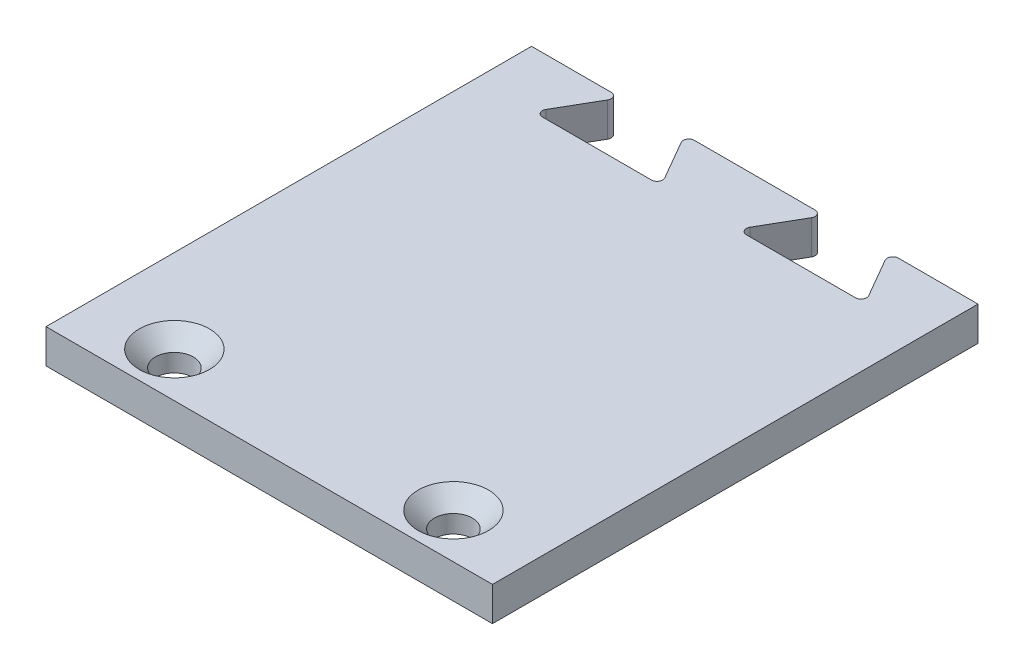
ISO-10303-21;
HEADER;
FILE_DESCRIPTION(('STEP AP214'),'2;1');
FILE_NAME('part.step','',(''),(''),'','','');
FILE_SCHEMA(('AUTOMOTIVE_DESIGN { 1 0 10303 214 1 1 1 1 }'));
ENDSEC;
DATA;
#1=APPLICATION_CONTEXT('core data for automotive mechanical design processes');
#2=APPLICATION_PROTOCOL_DEFINITION('international standard','automotive_design',2000,#1);
#3=PRODUCT_CONTEXT('',#1,'mechanical');
#4=PRODUCT('Part','Part','',(#3));
#5=PRODUCT_RELATED_PRODUCT_CATEGORY('part','',(#4));
#6=PRODUCT_DEFINITION_FORMATION('','',#4);
#7=PRODUCT_DEFINITION_CONTEXT('part definition',#1,'design');
#8=PRODUCT_DEFINITION('design','',#6,#7);
#9=PRODUCT_DEFINITION_SHAPE('','',#8);
#10=(LENGTH_UNIT() NAMED_UNIT(*) SI_UNIT(.MILLI.,.METRE.));
#11=(NAMED_UNIT(*) PLANE_ANGLE_UNIT() SI_UNIT($,.RADIAN.));
#12=(NAMED_UNIT(*) SI_UNIT($,.STERADIAN.) SOLID_ANGLE_UNIT());
#13=UNCERTAINTY_MEASURE_WITH_UNIT(LENGTH_MEASURE(1.E-05),#10,'distance_accuracy_value','');
#14=(GEOMETRIC_REPRESENTATION_CONTEXT(3) GLOBAL_UNCERTAINTY_ASSIGNED_CONTEXT((#13)) GLOBAL_UNIT_ASSIGNED_CONTEXT((#10,
#11,#12)) REPRESENTATION_CONTEXT('',''));
#15=CARTESIAN_POINT('',(0.,0.,0.));
#16=DIRECTION('',(0.,0.,1.));
#17=DIRECTION('',(1.,0.,0.));
#18=AXIS2_PLACEMENT_3D('',#15,#16,#17);
#19=CARTESIAN_POINT('',(0.,3.05,0.));
#20=DIRECTION('',(0.,-1.,0.));
#21=DIRECTION('',(0.,0.,-1.));
#22=AXIS2_PLACEMENT_3D('',#19,#20,#21);
#23=PLANE('',#22);
#24=CARTESIAN_POINT('',(7.5,3.05,-4.));
#25=DIRECTION('',(0.,1.,0.));
#26=DIRECTION('',(0.,0.,1.));
#27=AXIS2_PLACEMENT_3D('',#24,#25,#26);
#28=CIRCLE('',#27,3.15);
#29=CARTESIAN_POINT('',(7.5,3.05,-0.850000000000004));
#30=VERTEX_POINT('',#29);
#31=EDGE_CURVE('E613',#30,#30,#28,.T.);
#32=ORIENTED_EDGE('',*,*,#31,.F.);
#33=EDGE_LOOP('',(#32));
#34=FACE_BOUND('',#33,.T.);
#35=DIRECTION('',(-1.,0.,0.));
#36=VECTOR('',#35,1.);
#37=CARTESIAN_POINT('',(32.,3.05,-43.5));
#38=LINE('',#37,#36);
#39=CARTESIAN_POINT('',(40.,3.05,-43.5));
#40=VERTEX_POINT('',#39);
#41=CARTESIAN_POINT('',(32.8660254037844,3.05,-43.5));
#42=VERTEX_POINT('',#41);
#43=EDGE_CURVE('E184',#40,#42,#38,.T.);
#44=ORIENTED_EDGE('',*,*,#43,.T.);
#45=CARTESIAN_POINT('',(32.8660254037844,3.05,-43.));
#46=DIRECTION('',(0.,-1.,0.));
#47=DIRECTION('',(0.,0.,-1.));
#48=AXIS2_PLACEMENT_3D('',#45,#46,#47);
#49=CIRCLE('',#48,0.5);
#50=CARTESIAN_POINT('',(32.4330127018922,3.05,-42.75));
#51=VERTEX_POINT('',#50);
#52=EDGE_CURVE('E229',#42,#51,#49,.F.);
#53=ORIENTED_EDGE('',*,*,#52,.T.);
#54=DIRECTION('',(0.500000000000005,0.,0.866025403784436));
#55=VECTOR('',#54,1.);
#56=CARTESIAN_POINT('',(34.8867513459482,3.05,-38.5));
#57=LINE('',#56,#55);
#58=CARTESIAN_POINT('',(34.4537386440559,3.05,-39.25));
#59=VERTEX_POINT('',#58);
#60=EDGE_CURVE('E338',#51,#59,#57,.T.);
#61=ORIENTED_EDGE('',*,*,#60,.T.);
#62=CARTESIAN_POINT('',(34.0207259421637,3.05,-39.));
#63=DIRECTION('',(0.,-1.,0.));
#64=DIRECTION('',(0.,0.,-1.));
#65=AXIS2_PLACEMENT_3D('',#62,#63,#64);
#66=CIRCLE('',#65,0.5);
#67=CARTESIAN_POINT('',(34.0207259421637,3.05,-38.5));
#68=VERTEX_POINT('',#67);
#69=EDGE_CURVE('E260',#59,#68,#66,.T.);
#70=ORIENTED_EDGE('',*,*,#69,.T.);
#71=DIRECTION('',(-1.,0.,0.));
#72=VECTOR('',#71,1.);
#73=CARTESIAN_POINT('',(23.3867513459482,3.05,-38.5));
#74=LINE('',#73,#72);
#75=CARTESIAN_POINT('',(24.2527767497326,3.05,-38.5));
#76=VERTEX_POINT('',#75);
#77=EDGE_CURVE('E341',#68,#76,#74,.T.);
#78=ORIENTED_EDGE('',*,*,#77,.T.);
#79=CARTESIAN_POINT('',(24.2527767497326,3.05,-39.));
#80=DIRECTION('',(0.,-1.,0.));
#81=DIRECTION('',(0.,0.,-1.));
#82=AXIS2_PLACEMENT_3D('',#79,#80,#81);
#83=CIRCLE('',#82,0.5);
#84=CARTESIAN_POINT('',(23.8197640478404,3.05,-39.25));
#85=VERTEX_POINT('',#84);
#86=EDGE_CURVE('E264',#76,#85,#83,.T.);
#87=ORIENTED_EDGE('',*,*,#86,.T.);
#88=DIRECTION('',(0.500000000000004,0.,-0.866025403784437));
#89=VECTOR('',#88,1.);
#90=CARTESIAN_POINT('',(26.2735026918963,3.05,-43.5));
#91=LINE('',#90,#89);
#92=CARTESIAN_POINT('',(25.8404899900041,3.05,-42.75));
#93=VERTEX_POINT('',#92);
#94=EDGE_CURVE('E346',#85,#93,#91,.T.);
#95=ORIENTED_EDGE('',*,*,#94,.T.);
#96=CARTESIAN_POINT('',(25.4074772881119,3.05,-43.));
#97=DIRECTION('',(0.,-1.,0.));
#98=DIRECTION('',(0.,0.,-1.));
#99=AXIS2_PLACEMENT_3D('',#96,#97,#98);
#100=CIRCLE('',#99,0.5);
#101=CARTESIAN_POINT('',(25.4074772881119,3.05,-43.5));
#102=VERTEX_POINT('',#101);
#103=EDGE_CURVE('E227',#93,#102,#100,.F.);
#104=ORIENTED_EDGE('',*,*,#103,.T.);
#105=DIRECTION('',(-1.,0.,0.));
#106=VECTOR('',#105,1.);
#107=CARTESIAN_POINT('',(13.7264973081037,3.05,-43.5));
#108=LINE('',#107,#106);
#109=CARTESIAN_POINT('',(14.5925227118881,3.05,-43.5));
#110=VERTEX_POINT('',#109);
#111=EDGE_CURVE('E349',#102,#110,#108,.T.);
#112=ORIENTED_EDGE('',*,*,#111,.T.);
#113=CARTESIAN_POINT('',(14.5925227118881,3.05,-43.));
#114=DIRECTION('',(0.,-1.,0.));
#115=DIRECTION('',(0.,0.,-1.));
#116=AXIS2_PLACEMENT_3D('',#113,#114,#115);
#117=CIRCLE('',#116,0.5);
#118=CARTESIAN_POINT('',(14.1595100099959,3.05,-42.75));
#119=VERTEX_POINT('',#118);
#120=EDGE_CURVE('E225',#110,#119,#117,.F.);
#121=ORIENTED_EDGE('',*,*,#120,.T.);
#122=DIRECTION('',(0.500000000000004,0.,0.866025403784437));
#123=VECTOR('',#122,1.);
#124=CARTESIAN_POINT('',(16.6132486540518,3.05,-38.5));
#125=LINE('',#124,#123);
#126=CARTESIAN_POINT('',(16.1802359521596,3.05,-39.25));
#127=VERTEX_POINT('',#126);
#128=EDGE_CURVE('E295',#119,#127,#125,.T.);
#129=ORIENTED_EDGE('',*,*,#128,.T.);
#130=CARTESIAN_POINT('',(15.7472232502674,3.05,-39.));
#131=DIRECTION('',(0.,-1.,0.));
#132=DIRECTION('',(0.,0.,-1.));
#133=AXIS2_PLACEMENT_3D('',#130,#131,#132);
#134=CIRCLE('',#133,0.5);
#135=CARTESIAN_POINT('',(15.7472232502674,3.05,-38.5));
#136=VERTEX_POINT('',#135);
#137=EDGE_CURVE('E268',#127,#136,#134,.T.);
#138=ORIENTED_EDGE('',*,*,#137,.T.);
#139=DIRECTION('',(-1.,0.,0.));
#140=VECTOR('',#139,1.);
#141=CARTESIAN_POINT('',(5.11324865405184,3.05,-38.5));
#142=LINE('',#141,#140);
#143=CARTESIAN_POINT('',(5.97927405783628,3.05,-38.5));
#144=VERTEX_POINT('',#143);
#145=EDGE_CURVE('E290',#136,#144,#142,.T.);
#146=ORIENTED_EDGE('',*,*,#145,.T.);
#147=CARTESIAN_POINT('',(5.97927405783628,3.05,-39.));
#148=DIRECTION('',(0.,-1.,0.));
#149=DIRECTION('',(0.,0.,-1.));
#150=AXIS2_PLACEMENT_3D('',#147,#148,#149);
#151=CIRCLE('',#150,0.5);
#152=CARTESIAN_POINT('',(5.54626135594407,3.05,-39.25));
#153=VERTEX_POINT('',#152);
#154=EDGE_CURVE('E11',#144,#153,#151,.T.);
#155=ORIENTED_EDGE('',*,*,#154,.T.);
#156=DIRECTION('',(0.500000000000004,0.,-0.866025403784436));
#157=VECTOR('',#156,1.);
#158=CARTESIAN_POINT('',(8.,3.05,-43.5));
#159=LINE('',#158,#157);
#160=CARTESIAN_POINT('',(7.56698729810778,3.05,-42.75));
#161=VERTEX_POINT('',#160);
#162=EDGE_CURVE('E289',#153,#161,#159,.T.);
#163=ORIENTED_EDGE('',*,*,#162,.T.);
#164=CARTESIAN_POINT('',(7.13397459621556,3.05,-43.));
#165=DIRECTION('',(0.,-1.,0.));
#166=DIRECTION('',(0.,0.,-1.));
#167=AXIS2_PLACEMENT_3D('',#164,#165,#166);
#168=CIRCLE('',#167,0.5);
#169=CARTESIAN_POINT('',(7.13397459621556,3.05,-43.5));
#170=VERTEX_POINT('',#169);
#171=EDGE_CURVE('E51',#161,#170,#168,.F.);
#172=ORIENTED_EDGE('',*,*,#171,.T.);
#173=DIRECTION('',(-1.,0.,0.));
#174=VECTOR('',#173,1.);
#175=CARTESIAN_POINT('',(0.,3.05,-43.5));
#176=LINE('',#175,#174);
#177=CARTESIAN_POINT('',(0.,3.05,-43.5));
#178=VERTEX_POINT('',#177);
#179=EDGE_CURVE('E292',#170,#178,#176,.T.);
#180=ORIENTED_EDGE('',*,*,#179,.T.);
#181=DIRECTION('',(0.,0.,1.));
#182=VECTOR('',#181,1.);
#183=CARTESIAN_POINT('',(0.,3.05,0.));
#184=LINE('',#183,#182);
#185=CARTESIAN_POINT('',(0.,3.05,0.));
#186=VERTEX_POINT('',#185);
#187=EDGE_CURVE('E190',#178,#186,#184,.T.);
#188=ORIENTED_EDGE('',*,*,#187,.T.);
#189=DIRECTION('',(1.,0.,0.));
#190=VECTOR('',#189,1.);
#191=CARTESIAN_POINT('',(40.,3.05,0.));
#192=LINE('',#191,#190);
#193=CARTESIAN_POINT('',(40.,3.05,0.));
#194=VERTEX_POINT('',#193);
#195=EDGE_CURVE('E185',#186,#194,#192,.T.);
#196=ORIENTED_EDGE('',*,*,#195,.T.);
#197=DIRECTION('',(0.,0.,-1.));
#198=VECTOR('',#197,1.);
#199=CARTESIAN_POINT('',(40.,3.05,-43.5));
#200=LINE('',#199,#198);
#201=EDGE_CURVE('E174',#194,#40,#200,.T.);
#202=ORIENTED_EDGE('',*,*,#201,.T.);
#203=EDGE_LOOP('',(#44,#53,#61,#70,#78,#87,#95,#104,#112,#121,#129,#138,#146,#155,#163,#172,
#180,#188,#196,#202));
#204=FACE_BOUND('',#203,.T.);
#205=CARTESIAN_POINT('',(32.5,3.05,-4.));
#206=DIRECTION('',(0.,1.,0.));
#207=DIRECTION('',(0.,0.,1.));
#208=AXIS2_PLACEMENT_3D('',#205,#206,#207);
#209=CIRCLE('',#208,3.15);
#210=CARTESIAN_POINT('',(32.5,3.05,-0.85));
#211=VERTEX_POINT('',#210);
#212=EDGE_CURVE('E620',#211,#211,#209,.T.);
#213=ORIENTED_EDGE('',*,*,#212,.F.);
#214=EDGE_LOOP('',(#213));
#215=FACE_BOUND('',#214,.T.);
#216=ADVANCED_FACE('F36',(#34,#204,#215),#23,.F.);
#217=CARTESIAN_POINT('',(40.,3.05,0.));
#218=DIRECTION('',(0.,0.,-1.));
#219=DIRECTION('',(-1.,0.,0.));
#220=AXIS2_PLACEMENT_3D('',#217,#218,#219);
#221=PLANE('',#220);
#222=DIRECTION('',(1.,0.,0.));
#223=VECTOR('',#222,1.);
#224=CARTESIAN_POINT('',(40.,0.,0.));
#225=LINE('',#224,#223);
#226=CARTESIAN_POINT('',(0.,0.,0.));
#227=VERTEX_POINT('',#226);
#228=CARTESIAN_POINT('',(40.,0.,0.));
#229=VERTEX_POINT('',#228);
#230=EDGE_CURVE('E198',#227,#229,#225,.T.);
#231=ORIENTED_EDGE('',*,*,#230,.T.);
#232=DIRECTION('',(0.,-1.,0.));
#233=VECTOR('',#232,1.);
#234=CARTESIAN_POINT('',(40.,3.05,0.));
#235=LINE('',#234,#233);
#236=EDGE_CURVE('E178',#194,#229,#235,.T.);
#237=ORIENTED_EDGE('',*,*,#236,.F.);
#238=ORIENTED_EDGE('',*,*,#195,.F.);
#239=DIRECTION('',(0.,-1.,0.));
#240=VECTOR('',#239,1.);
#241=CARTESIAN_POINT('',(0.,3.05,0.));
#242=LINE('',#241,#240);
#243=EDGE_CURVE('E300',#186,#227,#242,.T.);
#244=ORIENTED_EDGE('',*,*,#243,.T.);
#245=EDGE_LOOP('',(#231,#237,#238,#244));
#246=FACE_BOUND('',#245,.T.);
#247=ADVANCED_FACE('F196',(#246),#221,.F.);
#248=CARTESIAN_POINT('',(40.,3.05,-43.5));
#249=DIRECTION('',(-1.,0.,0.));
#250=DIRECTION('',(0.,0.,1.));
#251=AXIS2_PLACEMENT_3D('',#248,#249,#250);
#252=PLANE('',#251);
#253=DIRECTION('',(0.,0.,-1.));
#254=VECTOR('',#253,1.);
#255=CARTESIAN_POINT('',(40.,0.,-43.5));
#256=LINE('',#255,#254);
#257=CARTESIAN_POINT('',(40.,0.,-43.5));
#258=VERTEX_POINT('',#257);
#259=EDGE_CURVE('E302',#229,#258,#256,.T.);
#260=ORIENTED_EDGE('',*,*,#259,.T.);
#261=DIRECTION('',(0.,-1.,0.));
#262=VECTOR('',#261,1.);
#263=CARTESIAN_POINT('',(40.,3.05,-43.5));
#264=LINE('',#263,#262);
#265=EDGE_CURVE('E181',#40,#258,#264,.T.);
#266=ORIENTED_EDGE('',*,*,#265,.F.);
#267=ORIENTED_EDGE('',*,*,#201,.F.);
#268=ORIENTED_EDGE('',*,*,#236,.T.);
#269=EDGE_LOOP('',(#260,#266,#267,#268));
#270=FACE_BOUND('',#269,.T.);
#271=ADVANCED_FACE('F176',(#270),#252,.F.);
#272=CARTESIAN_POINT('',(32.,3.05,-43.5));
#273=DIRECTION('',(0.,0.,1.));
#274=DIRECTION('',(1.,0.,0.));
#275=AXIS2_PLACEMENT_3D('',#272,#273,#274);
#276=PLANE('',#275);
#277=DIRECTION('',(-1.,0.,0.));
#278=VECTOR('',#277,1.);
#279=CARTESIAN_POINT('',(32.,0.,-43.5));
#280=LINE('',#279,#278);
#281=CARTESIAN_POINT('',(32.8660254037844,0.,-43.5));
#282=VERTEX_POINT('',#281);
#283=EDGE_CURVE('E305',#258,#282,#280,.T.);
#284=ORIENTED_EDGE('',*,*,#283,.T.);
#285=DIRECTION('',(0.,-1.,0.));
#286=VECTOR('',#285,1.);
#287=CARTESIAN_POINT('',(32.8660254037844,3.05,-43.5));
#288=LINE('',#287,#286);
#289=EDGE_CURVE('E222',#282,#42,#288,.F.);
#290=ORIENTED_EDGE('',*,*,#289,.T.);
#291=ORIENTED_EDGE('',*,*,#43,.F.);
#292=ORIENTED_EDGE('',*,*,#265,.T.);
#293=EDGE_LOOP('',(#284,#290,#291,#292));
#294=FACE_BOUND('',#293,.T.);
#295=ADVANCED_FACE('F335',(#294),#276,.F.);
#296=CARTESIAN_POINT('',(34.8867513459482,3.05,-38.5));
#297=DIRECTION('',(0.866025403784436,0.,-0.500000000000005));
#298=DIRECTION('',(-0.500000000000005,0.,-0.866025403784436));
#299=AXIS2_PLACEMENT_3D('',#296,#297,#298);
#300=PLANE('',#299);
#301=DIRECTION('',(0.500000000000005,0.,0.866025403784436));
#302=VECTOR('',#301,1.);
#303=CARTESIAN_POINT('',(34.8867513459482,0.,-38.5));
#304=LINE('',#303,#302);
#305=CARTESIAN_POINT('',(32.4330127018922,0.,-42.75));
#306=VERTEX_POINT('',#305);
#307=CARTESIAN_POINT('',(34.4537386440559,0.,-39.25));
#308=VERTEX_POINT('',#307);
#309=EDGE_CURVE('E308',#306,#308,#304,.T.);
#310=ORIENTED_EDGE('',*,*,#309,.T.);
#311=DIRECTION('',(0.,-1.,0.));
#312=VECTOR('',#311,1.);
#313=CARTESIAN_POINT('',(34.4537386440559,3.05,-39.25));
#314=LINE('',#313,#312);
#315=EDGE_CURVE('E212',#308,#59,#314,.F.);
#316=ORIENTED_EDGE('',*,*,#315,.T.);
#317=ORIENTED_EDGE('',*,*,#60,.F.);
#318=DIRECTION('',(0.,-1.,0.));
#319=VECTOR('',#318,1.);
#320=CARTESIAN_POINT('',(32.4330127018922,3.05,-42.75));
#321=LINE('',#320,#319);
#322=EDGE_CURVE('E209',#51,#306,#321,.T.);
#323=ORIENTED_EDGE('',*,*,#322,.T.);
#324=EDGE_LOOP('',(#310,#316,#317,#323));
#325=FACE_BOUND('',#324,.T.);
#326=ADVANCED_FACE('F393',(#325),#300,.F.);
#327=CARTESIAN_POINT('',(23.3867513459482,3.05,-38.5));
#328=DIRECTION('',(0.,0.,1.));
#329=DIRECTION('',(1.,0.,0.));
#330=AXIS2_PLACEMENT_3D('',#327,#328,#329);
#331=PLANE('',#330);
#332=ORIENTED_EDGE('',*,*,#77,.F.);
#333=DIRECTION('',(0.,-1.,0.));
#334=VECTOR('',#333,1.);
#335=CARTESIAN_POINT('',(34.0207259421637,0.,-38.5));
#336=LINE('',#335,#334);
#337=CARTESIAN_POINT('',(34.0207259421637,0.,-38.5));
#338=VERTEX_POINT('',#337);
#339=EDGE_CURVE('E201',#68,#338,#336,.T.);
#340=ORIENTED_EDGE('',*,*,#339,.T.);
#341=DIRECTION('',(-1.,0.,0.));
#342=VECTOR('',#341,1.);
#343=CARTESIAN_POINT('',(23.3867513459482,0.,-38.5));
#344=LINE('',#343,#342);
#345=CARTESIAN_POINT('',(24.2527767497326,0.,-38.5));
#346=VERTEX_POINT('',#345);
#347=EDGE_CURVE('E311',#338,#346,#344,.T.);
#348=ORIENTED_EDGE('',*,*,#347,.T.);
#349=DIRECTION('',(0.,-1.,0.));
#350=VECTOR('',#349,1.);
#351=CARTESIAN_POINT('',(24.2527767497326,3.05,-38.5));
#352=LINE('',#351,#350);
#353=EDGE_CURVE('E199',#346,#76,#352,.F.);
#354=ORIENTED_EDGE('',*,*,#353,.T.);
#355=EDGE_LOOP('',(#332,#340,#348,#354));
#356=FACE_BOUND('',#355,.T.);
#357=ADVANCED_FACE('F386',(#356),#331,.F.);
#358=CARTESIAN_POINT('',(26.2735026918963,3.05,-43.5));
#359=DIRECTION('',(-0.866025403784437,0.,-0.500000000000004));
#360=DIRECTION('',(-0.500000000000004,0.,0.866025403784437));
#361=AXIS2_PLACEMENT_3D('',#358,#359,#360);
#362=PLANE('',#361);
#363=ORIENTED_EDGE('',*,*,#94,.F.);
#364=DIRECTION('',(0.,-1.,0.));
#365=VECTOR('',#364,1.);
#366=CARTESIAN_POINT('',(23.8197640478404,0.,-39.25));
#367=LINE('',#366,#365);
#368=CARTESIAN_POINT('',(23.8197640478404,0.,-39.25));
#369=VERTEX_POINT('',#368);
#370=EDGE_CURVE('E233',#85,#369,#367,.T.);
#371=ORIENTED_EDGE('',*,*,#370,.T.);
#372=DIRECTION('',(0.500000000000004,0.,-0.866025403784437));
#373=VECTOR('',#372,1.);
#374=CARTESIAN_POINT('',(26.2735026918963,0.,-43.5));
#375=LINE('',#374,#373);
#376=CARTESIAN_POINT('',(25.8404899900041,0.,-42.75));
#377=VERTEX_POINT('',#376);
#378=EDGE_CURVE('E314',#369,#377,#375,.T.);
#379=ORIENTED_EDGE('',*,*,#378,.T.);
#380=DIRECTION('',(0.,-1.,0.));
#381=VECTOR('',#380,1.);
#382=CARTESIAN_POINT('',(25.8404899900041,3.05,-42.75));
#383=LINE('',#382,#381);
#384=EDGE_CURVE('E231',#377,#93,#383,.F.);
#385=ORIENTED_EDGE('',*,*,#384,.T.);
#386=EDGE_LOOP('',(#363,#371,#379,#385));
#387=FACE_BOUND('',#386,.T.);
#388=ADVANCED_FACE('F377',(#387),#362,.F.);
#389=CARTESIAN_POINT('',(13.7264973081037,3.05,-43.5));
#390=DIRECTION('',(0.,0.,1.));
#391=DIRECTION('',(1.,0.,0.));
#392=AXIS2_PLACEMENT_3D('',#389,#390,#391);
#393=PLANE('',#392);
#394=ORIENTED_EDGE('',*,*,#111,.F.);
#395=DIRECTION('',(0.,-1.,0.));
#396=VECTOR('',#395,1.);
#397=CARTESIAN_POINT('',(25.4074772881119,3.05,-43.5));
#398=LINE('',#397,#396);
#399=CARTESIAN_POINT('',(25.4074772881119,0.,-43.5));
#400=VERTEX_POINT('',#399);
#401=EDGE_CURVE('E238',#102,#400,#398,.T.);
#402=ORIENTED_EDGE('',*,*,#401,.T.);
#403=DIRECTION('',(-1.,0.,0.));
#404=VECTOR('',#403,1.);
#405=CARTESIAN_POINT('',(13.7264973081037,0.,-43.5));
#406=LINE('',#405,#404);
#407=CARTESIAN_POINT('',(14.5925227118881,0.,-43.5));
#408=VERTEX_POINT('',#407);
#409=EDGE_CURVE('E317',#400,#408,#406,.T.);
#410=ORIENTED_EDGE('',*,*,#409,.T.);
#411=DIRECTION('',(0.,-1.,0.));
#412=VECTOR('',#411,1.);
#413=CARTESIAN_POINT('',(14.5925227118881,3.05,-43.5));
#414=LINE('',#413,#412);
#415=EDGE_CURVE('E236',#408,#110,#414,.F.);
#416=ORIENTED_EDGE('',*,*,#415,.T.);
#417=EDGE_LOOP('',(#394,#402,#410,#416));
#418=FACE_BOUND('',#417,.T.);
#419=ADVANCED_FACE('F368',(#418),#393,.F.);
#420=CARTESIAN_POINT('',(16.6132486540518,3.05,-38.5));
#421=DIRECTION('',(0.866025403784436,0.,-0.500000000000004));
#422=DIRECTION('',(-0.500000000000004,0.,-0.866025403784437));
#423=AXIS2_PLACEMENT_3D('',#420,#421,#422);
#424=PLANE('',#423);
#425=ORIENTED_EDGE('',*,*,#128,.F.);
#426=DIRECTION('',(0.,-1.,0.));
#427=VECTOR('',#426,1.);
#428=CARTESIAN_POINT('',(14.1595100099959,3.05,-42.75));
#429=LINE('',#428,#427);
#430=CARTESIAN_POINT('',(14.1595100099959,0.,-42.75));
#431=VERTEX_POINT('',#430);
#432=EDGE_CURVE('E243',#119,#431,#429,.T.);
#433=ORIENTED_EDGE('',*,*,#432,.T.);
#434=DIRECTION('',(0.500000000000004,0.,0.866025403784437));
#435=VECTOR('',#434,1.);
#436=CARTESIAN_POINT('',(16.6132486540518,0.,-38.5));
#437=LINE('',#436,#435);
#438=CARTESIAN_POINT('',(16.1802359521596,0.,-39.25));
#439=VERTEX_POINT('',#438);
#440=EDGE_CURVE('E285',#431,#439,#437,.T.);
#441=ORIENTED_EDGE('',*,*,#440,.T.);
#442=DIRECTION('',(0.,-1.,0.));
#443=VECTOR('',#442,1.);
#444=CARTESIAN_POINT('',(16.1802359521596,3.05,-39.25));
#445=LINE('',#444,#443);
#446=EDGE_CURVE('E241',#439,#127,#445,.F.);
#447=ORIENTED_EDGE('',*,*,#446,.T.);
#448=EDGE_LOOP('',(#425,#433,#441,#447));
#449=FACE_BOUND('',#448,.T.);
#450=ADVANCED_FACE('F361',(#449),#424,.F.);
#451=CARTESIAN_POINT('',(5.11324865405184,3.05,-38.5));
#452=DIRECTION('',(0.,0.,1.));
#453=DIRECTION('',(1.,0.,0.));
#454=AXIS2_PLACEMENT_3D('',#451,#452,#453);
#455=PLANE('',#454);
#456=ORIENTED_EDGE('',*,*,#145,.F.);
#457=DIRECTION('',(0.,-1.,0.));
#458=VECTOR('',#457,1.);
#459=CARTESIAN_POINT('',(15.7472232502674,0.,-38.5));
#460=LINE('',#459,#458);
#461=CARTESIAN_POINT('',(15.7472232502674,0.,-38.5));
#462=VERTEX_POINT('',#461);
#463=EDGE_CURVE('E248',#136,#462,#460,.T.);
#464=ORIENTED_EDGE('',*,*,#463,.T.);
#465=DIRECTION('',(-1.,0.,0.));
#466=VECTOR('',#465,1.);
#467=CARTESIAN_POINT('',(5.11324865405184,0.,-38.5));
#468=LINE('',#467,#466);
#469=CARTESIAN_POINT('',(5.97927405783628,0.,-38.5));
#470=VERTEX_POINT('',#469);
#471=EDGE_CURVE('E275',#462,#470,#468,.T.);
#472=ORIENTED_EDGE('',*,*,#471,.T.);
#473=DIRECTION('',(0.,-1.,0.));
#474=VECTOR('',#473,1.);
#475=CARTESIAN_POINT('',(5.97927405783628,3.05,-38.5));
#476=LINE('',#475,#474);
#477=EDGE_CURVE('E246',#470,#144,#476,.F.);
#478=ORIENTED_EDGE('',*,*,#477,.T.);
#479=EDGE_LOOP('',(#456,#464,#472,#478));
#480=FACE_BOUND('',#479,.T.);
#481=ADVANCED_FACE('F282',(#480),#455,.F.);
#482=CARTESIAN_POINT('',(8.,3.05,-43.5));
#483=DIRECTION('',(-0.866025403784436,0.,-0.500000000000004));
#484=DIRECTION('',(-0.500000000000004,0.,0.866025403784436));
#485=AXIS2_PLACEMENT_3D('',#482,#483,#484);
#486=PLANE('',#485);
#487=ORIENTED_EDGE('',*,*,#162,.F.);
#488=DIRECTION('',(0.,-1.,0.));
#489=VECTOR('',#488,1.);
#490=CARTESIAN_POINT('',(5.54626135594407,0.,-39.25));
#491=LINE('',#490,#489);
#492=CARTESIAN_POINT('',(5.54626135594407,0.,-39.25));
#493=VERTEX_POINT('',#492);
#494=EDGE_CURVE('E252',#153,#493,#491,.T.);
#495=ORIENTED_EDGE('',*,*,#494,.T.);
#496=DIRECTION('',(0.500000000000004,0.,-0.866025403784436));
#497=VECTOR('',#496,1.);
#498=CARTESIAN_POINT('',(8.,0.,-43.5));
#499=LINE('',#498,#497);
#500=CARTESIAN_POINT('',(7.56698729810778,0.,-42.75));
#501=VERTEX_POINT('',#500);
#502=EDGE_CURVE('E276',#493,#501,#499,.T.);
#503=ORIENTED_EDGE('',*,*,#502,.T.);
#504=DIRECTION('',(0.,-1.,0.));
#505=VECTOR('',#504,1.);
#506=CARTESIAN_POINT('',(7.56698729810778,3.05,-42.75));
#507=LINE('',#506,#505);
#508=EDGE_CURVE('E59',#501,#161,#507,.F.);
#509=ORIENTED_EDGE('',*,*,#508,.T.);
#510=EDGE_LOOP('',(#487,#495,#503,#509));
#511=FACE_BOUND('',#510,.T.);
#512=ADVANCED_FACE('F291',(#511),#486,.F.);
#513=CARTESIAN_POINT('',(0.,3.05,-43.5));
#514=DIRECTION('',(0.,0.,1.));
#515=DIRECTION('',(1.,0.,0.));
#516=AXIS2_PLACEMENT_3D('',#513,#514,#515);
#517=PLANE('',#516);
#518=ORIENTED_EDGE('',*,*,#179,.F.);
#519=DIRECTION('',(0.,-1.,0.));
#520=VECTOR('',#519,1.);
#521=CARTESIAN_POINT('',(7.13397459621556,3.05,-43.5));
#522=LINE('',#521,#520);
#523=CARTESIAN_POINT('',(7.13397459621556,0.,-43.5));
#524=VERTEX_POINT('',#523);
#525=EDGE_CURVE('E255',#170,#524,#522,.T.);
#526=ORIENTED_EDGE('',*,*,#525,.T.);
#527=DIRECTION('',(-1.,0.,0.));
#528=VECTOR('',#527,1.);
#529=CARTESIAN_POINT('',(0.,0.,-43.5));
#530=LINE('',#529,#528);
#531=CARTESIAN_POINT('',(0.,0.,-43.5));
#532=VERTEX_POINT('',#531);
#533=EDGE_CURVE('E323',#524,#532,#530,.T.);
#534=ORIENTED_EDGE('',*,*,#533,.T.);
#535=DIRECTION('',(0.,-1.,0.));
#536=VECTOR('',#535,1.);
#537=CARTESIAN_POINT('',(0.,3.05,-43.5));
#538=LINE('',#537,#536);
#539=EDGE_CURVE('E203',#178,#532,#538,.T.);
#540=ORIENTED_EDGE('',*,*,#539,.F.);
#541=EDGE_LOOP('',(#518,#526,#534,#540));
#542=FACE_BOUND('',#541,.T.);
#543=ADVANCED_FACE('F423',(#542),#517,.F.);
#544=CARTESIAN_POINT('',(0.,3.05,0.));
#545=DIRECTION('',(1.,0.,0.));
#546=DIRECTION('',(0.,0.,-1.));
#547=AXIS2_PLACEMENT_3D('',#544,#545,#546);
#548=PLANE('',#547);
#549=DIRECTION('',(0.,0.,1.));
#550=VECTOR('',#549,1.);
#551=CARTESIAN_POINT('',(0.,0.,0.));
#552=LINE('',#551,#550);
#553=EDGE_CURVE('E194',#532,#227,#552,.T.);
#554=ORIENTED_EDGE('',*,*,#553,.T.);
#555=ORIENTED_EDGE('',*,*,#243,.F.);
#556=ORIENTED_EDGE('',*,*,#187,.F.);
#557=ORIENTED_EDGE('',*,*,#539,.T.);
#558=EDGE_LOOP('',(#554,#555,#556,#557));
#559=FACE_BOUND('',#558,.T.);
#560=ADVANCED_FACE('F330',(#559),#548,.F.);
#561=CARTESIAN_POINT('',(0.,0.,0.));
#562=DIRECTION('',(0.,-1.,0.));
#563=DIRECTION('',(0.,0.,-1.));
#564=AXIS2_PLACEMENT_3D('',#561,#562,#563);
#565=PLANE('',#564);
#566=CARTESIAN_POINT('',(7.5,0.,-4.));
#567=DIRECTION('',(0.,1.,0.));
#568=DIRECTION('',(0.,0.,1.));
#569=AXIS2_PLACEMENT_3D('',#566,#567,#568);
#570=CIRCLE('',#569,1.7);
#571=CARTESIAN_POINT('',(7.5,0.,-2.30000000000001));
#572=VERTEX_POINT('',#571);
#573=EDGE_CURVE('E615',#572,#572,#570,.T.);
#574=ORIENTED_EDGE('',*,*,#573,.T.);
#575=EDGE_LOOP('',(#574));
#576=FACE_BOUND('',#575,.T.);
#577=CARTESIAN_POINT('',(32.5,0.,-4.));
#578=DIRECTION('',(0.,1.,0.));
#579=DIRECTION('',(0.,0.,1.));
#580=AXIS2_PLACEMENT_3D('',#577,#578,#579);
#581=CIRCLE('',#580,1.7);
#582=CARTESIAN_POINT('',(32.5,0.,-2.3));
#583=VERTEX_POINT('',#582);
#584=EDGE_CURVE('E303',#583,#583,#581,.T.);
#585=ORIENTED_EDGE('',*,*,#584,.T.);
#586=EDGE_LOOP('',(#585));
#587=FACE_BOUND('',#586,.T.);
#588=ORIENTED_EDGE('',*,*,#309,.F.);
#589=CARTESIAN_POINT('',(32.8660254037844,0.,-43.));
#590=DIRECTION('',(0.,-1.,0.));
#591=DIRECTION('',(0.,0.,-1.));
#592=AXIS2_PLACEMENT_3D('',#589,#590,#591);
#593=CIRCLE('',#592,0.5);
#594=EDGE_CURVE('E220',#306,#282,#593,.T.);
#595=ORIENTED_EDGE('',*,*,#594,.T.);
#596=ORIENTED_EDGE('',*,*,#283,.F.);
#597=ORIENTED_EDGE('',*,*,#259,.F.);
#598=ORIENTED_EDGE('',*,*,#230,.F.);
#599=ORIENTED_EDGE('',*,*,#553,.F.);
#600=ORIENTED_EDGE('',*,*,#533,.F.);
#601=CARTESIAN_POINT('',(7.13397459621556,0.,-43.));
#602=DIRECTION('',(0.,-1.,0.));
#603=DIRECTION('',(0.,0.,-1.));
#604=AXIS2_PLACEMENT_3D('',#601,#602,#603);
#605=CIRCLE('',#604,0.5);
#606=EDGE_CURVE('E214',#524,#501,#605,.T.);
#607=ORIENTED_EDGE('',*,*,#606,.T.);
#608=ORIENTED_EDGE('',*,*,#502,.F.);
#609=CARTESIAN_POINT('',(5.97927405783628,0.,-39.));
#610=DIRECTION('',(0.,-1.,0.));
#611=DIRECTION('',(0.,0.,-1.));
#612=AXIS2_PLACEMENT_3D('',#609,#610,#611);
#613=CIRCLE('',#612,0.5);
#614=EDGE_CURVE('E44',#493,#470,#613,.F.);
#615=ORIENTED_EDGE('',*,*,#614,.T.);
#616=ORIENTED_EDGE('',*,*,#471,.F.);
#617=CARTESIAN_POINT('',(15.7472232502674,0.,-39.));
#618=DIRECTION('',(0.,-1.,0.));
#619=DIRECTION('',(0.,0.,-1.));
#620=AXIS2_PLACEMENT_3D('',#617,#618,#619);
#621=CIRCLE('',#620,0.5);
#622=EDGE_CURVE('E266',#462,#439,#621,.F.);
#623=ORIENTED_EDGE('',*,*,#622,.T.);
#624=ORIENTED_EDGE('',*,*,#440,.F.);
#625=CARTESIAN_POINT('',(14.5925227118881,0.,-43.));
#626=DIRECTION('',(0.,-1.,0.));
#627=DIRECTION('',(0.,0.,-1.));
#628=AXIS2_PLACEMENT_3D('',#625,#626,#627);
#629=CIRCLE('',#628,0.5);
#630=EDGE_CURVE('E216',#431,#408,#629,.T.);
#631=ORIENTED_EDGE('',*,*,#630,.T.);
#632=ORIENTED_EDGE('',*,*,#409,.F.);
#633=CARTESIAN_POINT('',(25.4074772881119,0.,-43.));
#634=DIRECTION('',(0.,-1.,0.));
#635=DIRECTION('',(0.,0.,-1.));
#636=AXIS2_PLACEMENT_3D('',#633,#634,#635);
#637=CIRCLE('',#636,0.5);
#638=EDGE_CURVE('E218',#400,#377,#637,.T.);
#639=ORIENTED_EDGE('',*,*,#638,.T.);
#640=ORIENTED_EDGE('',*,*,#378,.F.);
#641=CARTESIAN_POINT('',(24.2527767497326,0.,-39.));
#642=DIRECTION('',(0.,-1.,0.));
#643=DIRECTION('',(0.,0.,-1.));
#644=AXIS2_PLACEMENT_3D('',#641,#642,#643);
#645=CIRCLE('',#644,0.5);
#646=EDGE_CURVE('E262',#369,#346,#645,.F.);
#647=ORIENTED_EDGE('',*,*,#646,.T.);
#648=ORIENTED_EDGE('',*,*,#347,.F.);
#649=CARTESIAN_POINT('',(34.0207259421637,0.,-39.));
#650=DIRECTION('',(0.,-1.,0.));
#651=DIRECTION('',(0.,0.,-1.));
#652=AXIS2_PLACEMENT_3D('',#649,#650,#651);
#653=CIRCLE('',#652,0.5);
#654=EDGE_CURVE('E258',#338,#308,#653,.F.);
#655=ORIENTED_EDGE('',*,*,#654,.T.);
#656=EDGE_LOOP('',(#588,#595,#596,#597,#598,#599,#600,#607,#608,#615,#616,#623,#624,#631,#632,
#639,#640,#647,#648,#655));
#657=FACE_BOUND('',#656,.T.);
#658=ADVANCED_FACE('F274',(#576,#587,#657),#565,.T.);
#659=CARTESIAN_POINT('',(34.0207259421637,3.05,-39.));
#660=DIRECTION('',(0.,1.,0.));
#661=DIRECTION('',(0.,0.,1.));
#662=AXIS2_PLACEMENT_3D('',#659,#660,#661);
#663=CYLINDRICAL_SURFACE('',#662,0.5);
#664=ORIENTED_EDGE('',*,*,#69,.F.);
#665=ORIENTED_EDGE('',*,*,#315,.F.);
#666=ORIENTED_EDGE('',*,*,#654,.F.);
#667=ORIENTED_EDGE('',*,*,#339,.F.);
#668=EDGE_LOOP('',(#664,#665,#666,#667));
#669=FACE_BOUND('',#668,.T.);
#670=ADVANCED_FACE('F390',(#669),#663,.F.);
#671=CARTESIAN_POINT('',(32.8660254037844,3.05,-43.));
#672=DIRECTION('',(0.,-1.,0.));
#673=DIRECTION('',(0.,0.,-1.));
#674=AXIS2_PLACEMENT_3D('',#671,#672,#673);
#675=CYLINDRICAL_SURFACE('',#674,0.5);
#676=ORIENTED_EDGE('',*,*,#52,.F.);
#677=ORIENTED_EDGE('',*,*,#289,.F.);
#678=ORIENTED_EDGE('',*,*,#594,.F.);
#679=ORIENTED_EDGE('',*,*,#322,.F.);
#680=EDGE_LOOP('',(#676,#677,#678,#679));
#681=FACE_BOUND('',#680,.T.);
#682=ADVANCED_FACE('F397',(#681),#675,.T.);
#683=CARTESIAN_POINT('',(24.2527767497326,3.05,-39.));
#684=DIRECTION('',(0.,1.,0.));
#685=DIRECTION('',(0.,0.,1.));
#686=AXIS2_PLACEMENT_3D('',#683,#684,#685);
#687=CYLINDRICAL_SURFACE('',#686,0.5);
#688=ORIENTED_EDGE('',*,*,#86,.F.);
#689=ORIENTED_EDGE('',*,*,#353,.F.);
#690=ORIENTED_EDGE('',*,*,#646,.F.);
#691=ORIENTED_EDGE('',*,*,#370,.F.);
#692=EDGE_LOOP('',(#688,#689,#690,#691));
#693=FACE_BOUND('',#692,.T.);
#694=ADVANCED_FACE('F381',(#693),#687,.F.);
#695=CARTESIAN_POINT('',(25.4074772881119,3.05,-43.));
#696=DIRECTION('',(0.,-1.,0.));
#697=DIRECTION('',(0.,0.,-1.));
#698=AXIS2_PLACEMENT_3D('',#695,#696,#697);
#699=CYLINDRICAL_SURFACE('',#698,0.5);
#700=ORIENTED_EDGE('',*,*,#103,.F.);
#701=ORIENTED_EDGE('',*,*,#384,.F.);
#702=ORIENTED_EDGE('',*,*,#638,.F.);
#703=ORIENTED_EDGE('',*,*,#401,.F.);
#704=EDGE_LOOP('',(#700,#701,#702,#703));
#705=FACE_BOUND('',#704,.T.);
#706=ADVANCED_FACE('F372',(#705),#699,.T.);
#707=CARTESIAN_POINT('',(14.5925227118881,3.05,-43.));
#708=DIRECTION('',(0.,-1.,0.));
#709=DIRECTION('',(0.,0.,-1.));
#710=AXIS2_PLACEMENT_3D('',#707,#708,#709);
#711=CYLINDRICAL_SURFACE('',#710,0.5);
#712=ORIENTED_EDGE('',*,*,#120,.F.);
#713=ORIENTED_EDGE('',*,*,#415,.F.);
#714=ORIENTED_EDGE('',*,*,#630,.F.);
#715=ORIENTED_EDGE('',*,*,#432,.F.);
#716=EDGE_LOOP('',(#712,#713,#714,#715));
#717=FACE_BOUND('',#716,.T.);
#718=ADVANCED_FACE('F363',(#717),#711,.T.);
#719=CARTESIAN_POINT('',(15.7472232502674,3.05,-39.));
#720=DIRECTION('',(0.,1.,0.));
#721=DIRECTION('',(0.,0.,1.));
#722=AXIS2_PLACEMENT_3D('',#719,#720,#721);
#723=CYLINDRICAL_SURFACE('',#722,0.5);
#724=ORIENTED_EDGE('',*,*,#137,.F.);
#725=ORIENTED_EDGE('',*,*,#446,.F.);
#726=ORIENTED_EDGE('',*,*,#622,.F.);
#727=ORIENTED_EDGE('',*,*,#463,.F.);
#728=EDGE_LOOP('',(#724,#725,#726,#727));
#729=FACE_BOUND('',#728,.T.);
#730=ADVANCED_FACE('F359',(#729),#723,.F.);
#731=CARTESIAN_POINT('',(5.97927405783628,3.05,-39.));
#732=DIRECTION('',(0.,1.,0.));
#733=DIRECTION('',(0.,0.,1.));
#734=AXIS2_PLACEMENT_3D('',#731,#732,#733);
#735=CYLINDRICAL_SURFACE('',#734,0.5);
#736=ORIENTED_EDGE('',*,*,#154,.F.);
#737=ORIENTED_EDGE('',*,*,#477,.F.);
#738=ORIENTED_EDGE('',*,*,#614,.F.);
#739=ORIENTED_EDGE('',*,*,#494,.F.);
#740=EDGE_LOOP('',(#736,#737,#738,#739));
#741=FACE_BOUND('',#740,.T.);
#742=ADVANCED_FACE('F288',(#741),#735,.F.);
#743=CARTESIAN_POINT('',(7.13397459621556,3.05,-43.));
#744=DIRECTION('',(0.,-1.,0.));
#745=DIRECTION('',(0.,0.,-1.));
#746=AXIS2_PLACEMENT_3D('',#743,#744,#745);
#747=CYLINDRICAL_SURFACE('',#746,0.5);
#748=ORIENTED_EDGE('',*,*,#171,.F.);
#749=ORIENTED_EDGE('',*,*,#508,.F.);
#750=ORIENTED_EDGE('',*,*,#606,.F.);
#751=ORIENTED_EDGE('',*,*,#525,.F.);
#752=EDGE_LOOP('',(#748,#749,#750,#751));
#753=FACE_BOUND('',#752,.T.);
#754=ADVANCED_FACE('F38',(#753),#747,.T.);
#755=CARTESIAN_POINT('',(32.5,3.05,-4.));
#756=DIRECTION('',(0.,1.,0.));
#757=DIRECTION('',(0.,0.,1.));
#758=AXIS2_PLACEMENT_3D('',#755,#756,#757);
#759=CYLINDRICAL_SURFACE('',#758,1.69999999999999);
#760=ORIENTED_EDGE('',*,*,#584,.F.);
#761=EDGE_LOOP('',(#760));
#762=FACE_BOUND('',#761,.T.);
#763=CARTESIAN_POINT('',(32.5,1.59999999999999,-4.));
#764=DIRECTION('',(0.,1.,0.));
#765=DIRECTION('',(0.,0.,1.));
#766=AXIS2_PLACEMENT_3D('',#763,#764,#765);
#767=CIRCLE('',#766,1.69999999999999);
#768=CARTESIAN_POINT('',(32.5,1.59999999999999,-2.30000000000001));
#769=VERTEX_POINT('',#768);
#770=EDGE_CURVE('E623',#769,#769,#767,.T.);
#771=ORIENTED_EDGE('',*,*,#770,.T.);
#772=EDGE_LOOP('',(#771));
#773=FACE_BOUND('',#772,.T.);
#774=ADVANCED_FACE('F416',(#762,#773),#759,.F.);
#775=CARTESIAN_POINT('',(32.5,3.05,-4.));
#776=DIRECTION('',(0.,1.,0.));
#777=DIRECTION('',(0.,0.,1.));
#778=AXIS2_PLACEMENT_3D('',#775,#776,#777);
#779=CONICAL_SURFACE('',#778,3.15,0.78539816339745);
#780=ORIENTED_EDGE('',*,*,#770,.F.);
#781=EDGE_LOOP('',(#780));
#782=FACE_BOUND('',#781,.T.);
#783=ORIENTED_EDGE('',*,*,#212,.T.);
#784=EDGE_LOOP('',(#783));
#785=FACE_BOUND('',#784,.T.);
#786=ADVANCED_FACE('F569',(#782,#785),#779,.F.);
#787=CARTESIAN_POINT('',(7.5,3.05,-4.));
#788=DIRECTION('',(0.,1.,0.));
#789=DIRECTION('',(0.,0.,1.));
#790=AXIS2_PLACEMENT_3D('',#787,#788,#789);
#791=CYLINDRICAL_SURFACE('',#790,1.69999999999999);
#792=ORIENTED_EDGE('',*,*,#573,.F.);
#793=EDGE_LOOP('',(#792));
#794=FACE_BOUND('',#793,.T.);
#795=CARTESIAN_POINT('',(7.5,1.59999999999999,-4.));
#796=DIRECTION('',(0.,1.,0.));
#797=DIRECTION('',(0.,0.,1.));
#798=AXIS2_PLACEMENT_3D('',#795,#796,#797);
#799=CIRCLE('',#798,1.69999999999999);
#800=CARTESIAN_POINT('',(7.5,1.59999999999999,-2.30000000000002));
#801=VERTEX_POINT('',#800);
#802=EDGE_CURVE('E611',#801,#801,#799,.T.);
#803=ORIENTED_EDGE('',*,*,#802,.T.);
#804=EDGE_LOOP('',(#803));
#805=FACE_BOUND('',#804,.T.);
#806=ADVANCED_FACE('F577',(#794,#805),#791,.F.);
#807=CARTESIAN_POINT('',(7.5,3.05,-4.));
#808=DIRECTION('',(0.,1.,0.));
#809=DIRECTION('',(0.,0.,1.));
#810=AXIS2_PLACEMENT_3D('',#807,#808,#809);
#811=CONICAL_SURFACE('',#810,3.15,0.78539816339745);
#812=ORIENTED_EDGE('',*,*,#802,.F.);
#813=EDGE_LOOP('',(#812));
#814=FACE_BOUND('',#813,.T.);
#815=ORIENTED_EDGE('',*,*,#31,.T.);
#816=EDGE_LOOP('',(#815));
#817=FACE_BOUND('',#816,.T.);
#818=ADVANCED_FACE('F586',(#814,#817),#811,.F.);
#819=CLOSED_SHELL('',(#216,#247,#271,#295,#326,#357,#388,#419,#450,#481,#512,#543,#560,#658,
#670,#682,#694,#706,#718,#730,#742,#754,#774,#786,#806,#818));
#820=MANIFOLD_SOLID_BREP('B2',#819);
#821=ADVANCED_BREP_SHAPE_REPRESENTATION('',(#18,#820),#14);
#822=SHAPE_DEFINITION_REPRESENTATION(#9,#821);
ENDSEC;
END-ISO-10303-21;
